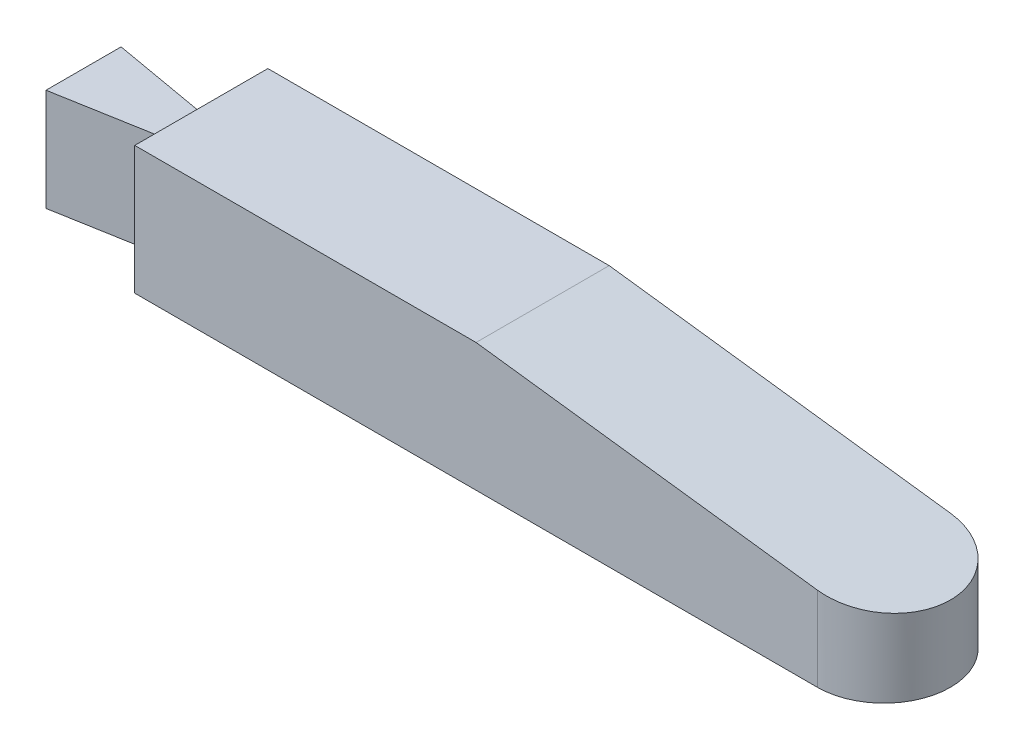
ISO-10303-21;
HEADER;
FILE_DESCRIPTION(('STEP AP214'),'2;1');
FILE_NAME('part.step','',(''),(''),'','','');
FILE_SCHEMA(('AUTOMOTIVE_DESIGN { 1 0 10303 214 1 1 1 1 }'));
ENDSEC;
DATA;
#1=APPLICATION_CONTEXT('core data for automotive mechanical design processes');
#2=APPLICATION_PROTOCOL_DEFINITION('international standard','automotive_design',2000,#1);
#3=PRODUCT_CONTEXT('',#1,'mechanical');
#4=PRODUCT('Part','Part','',(#3));
#5=PRODUCT_RELATED_PRODUCT_CATEGORY('part','',(#4));
#6=PRODUCT_DEFINITION_FORMATION('','',#4);
#7=PRODUCT_DEFINITION_CONTEXT('part definition',#1,'design');
#8=PRODUCT_DEFINITION('design','',#6,#7);
#9=PRODUCT_DEFINITION_SHAPE('','',#8);
#10=(LENGTH_UNIT() NAMED_UNIT(*) SI_UNIT(.MILLI.,.METRE.));
#11=(NAMED_UNIT(*) PLANE_ANGLE_UNIT() SI_UNIT($,.RADIAN.));
#12=(NAMED_UNIT(*) SI_UNIT($,.STERADIAN.) SOLID_ANGLE_UNIT());
#13=UNCERTAINTY_MEASURE_WITH_UNIT(LENGTH_MEASURE(1.E-05),#10,'distance_accuracy_value','');
#14=(GEOMETRIC_REPRESENTATION_CONTEXT(3) GLOBAL_UNCERTAINTY_ASSIGNED_CONTEXT((#13)) GLOBAL_UNIT_ASSIGNED_CONTEXT((#10,
#11,#12)) REPRESENTATION_CONTEXT('',''));
#15=CARTESIAN_POINT('',(0.,0.,0.));
#16=DIRECTION('',(0.,0.,1.));
#17=DIRECTION('',(1.,0.,0.));
#18=AXIS2_PLACEMENT_3D('',#15,#16,#17);
#19=CARTESIAN_POINT('',(-35.052,38.1,8.63600000000001));
#20=DIRECTION('',(-0.173648177666927,0.,0.984807753012209));
#21=DIRECTION('',(0.984807753012209,0.,0.173648177666927));
#22=AXIS2_PLACEMENT_3D('',#19,#20,#21);
#23=PLANE('',#22);
#24=DIRECTION('',(-0.984807753012209,0.,-0.173648177666927));
#25=VECTOR('',#24,1.);
#26=CARTESIAN_POINT('',(0.,30.48,14.816613327793));
#27=LINE('',#26,#25);
#28=CARTESIAN_POINT('',(0.,30.48,14.816613327793));
#29=VERTEX_POINT('',#28);
#30=CARTESIAN_POINT('',(-35.052,30.48,8.63600000000001));
#31=VERTEX_POINT('',#30);
#32=EDGE_CURVE('E198',#29,#31,#27,.T.);
#33=ORIENTED_EDGE('',*,*,#32,.F.);
#34=DIRECTION('',(0.,-1.,0.));
#35=VECTOR('',#34,1.);
#36=CARTESIAN_POINT('',(0.,38.1,14.816613327793));
#37=LINE('',#36,#35);
#38=CARTESIAN_POINT('',(0.,0.,14.816613327793));
#39=VERTEX_POINT('',#38);
#40=EDGE_CURVE('E11',#29,#39,#37,.T.);
#41=ORIENTED_EDGE('',*,*,#40,.T.);
#42=DIRECTION('',(-0.984807753012209,0.,-0.173648177666927));
#43=VECTOR('',#42,1.);
#44=CARTESIAN_POINT('',(-35.052,0.,8.63600000000001));
#45=LINE('',#44,#43);
#46=CARTESIAN_POINT('',(-35.052,0.,8.63600000000001));
#47=VERTEX_POINT('',#46);
#48=EDGE_CURVE('E124',#39,#47,#45,.T.);
#49=ORIENTED_EDGE('',*,*,#48,.T.);
#50=DIRECTION('',(0.,-1.,0.));
#51=VECTOR('',#50,1.);
#52=CARTESIAN_POINT('',(-35.052,38.1,8.63600000000001));
#53=LINE('',#52,#51);
#54=EDGE_CURVE('E53',#31,#47,#53,.T.);
#55=ORIENTED_EDGE('',*,*,#54,.F.);
#56=EDGE_LOOP('',(#33,#41,#49,#55));
#57=FACE_BOUND('',#56,.T.);
#58=ADVANCED_FACE('F45',(#57),#23,.F.);
#59=CARTESIAN_POINT('',(-35.052,38.1,8.63600000000001));
#60=DIRECTION('',(1.,0.,0.));
#61=DIRECTION('',(0.,0.,-1.));
#62=AXIS2_PLACEMENT_3D('',#59,#60,#61);
#63=PLANE('',#62);
#64=DIRECTION('',(0.,0.,1.));
#65=VECTOR('',#64,1.);
#66=CARTESIAN_POINT('',(-35.052,30.48,8.63600000000001));
#67=LINE('',#66,#65);
#68=CARTESIAN_POINT('',(-35.052,30.48,30.988));
#69=VERTEX_POINT('',#68);
#70=EDGE_CURVE('E177',#31,#69,#67,.T.);
#71=ORIENTED_EDGE('',*,*,#70,.F.);
#72=ORIENTED_EDGE('',*,*,#54,.T.);
#73=DIRECTION('',(0.,0.,1.));
#74=VECTOR('',#73,1.);
#75=CARTESIAN_POINT('',(-35.052,0.,8.63600000000001));
#76=LINE('',#75,#74);
#77=CARTESIAN_POINT('',(-35.052,0.,30.988));
#78=VERTEX_POINT('',#77);
#79=EDGE_CURVE('E130',#47,#78,#76,.T.);
#80=ORIENTED_EDGE('',*,*,#79,.T.);
#81=DIRECTION('',(0.,-1.,0.));
#82=VECTOR('',#81,1.);
#83=CARTESIAN_POINT('',(-35.052,38.1,30.988));
#84=LINE('',#83,#82);
#85=EDGE_CURVE('E166',#69,#78,#84,.T.);
#86=ORIENTED_EDGE('',*,*,#85,.F.);
#87=EDGE_LOOP('',(#71,#72,#80,#86));
#88=FACE_BOUND('',#87,.T.);
#89=ADVANCED_FACE('F172',(#88),#63,.F.);
#90=CARTESIAN_POINT('',(-35.052,38.1,30.988));
#91=DIRECTION('',(-0.173648177666928,0.,-0.984807753012209));
#92=DIRECTION('',(-0.984807753012209,0.,0.173648177666928));
#93=AXIS2_PLACEMENT_3D('',#90,#91,#92);
#94=PLANE('',#93);
#95=DIRECTION('',(0.984807753012208,0.,-0.173648177666928));
#96=VECTOR('',#95,1.);
#97=CARTESIAN_POINT('',(-35.052,30.48,30.988));
#98=LINE('',#97,#96);
#99=CARTESIAN_POINT('',(0.,30.48,24.807386672207));
#100=VERTEX_POINT('',#99);
#101=EDGE_CURVE('E133',#69,#100,#98,.T.);
#102=ORIENTED_EDGE('',*,*,#101,.F.);
#103=ORIENTED_EDGE('',*,*,#85,.T.);
#104=DIRECTION('',(0.984807753012208,0.,-0.173648177666928));
#105=VECTOR('',#104,1.);
#106=CARTESIAN_POINT('',(-35.052,0.,30.988));
#107=LINE('',#106,#105);
#108=CARTESIAN_POINT('',(0.,0.,24.807386672207));
#109=VERTEX_POINT('',#108);
#110=EDGE_CURVE('E141',#78,#109,#107,.T.);
#111=ORIENTED_EDGE('',*,*,#110,.T.);
#112=DIRECTION('',(0.,-1.,0.));
#113=VECTOR('',#112,1.);
#114=CARTESIAN_POINT('',(0.,38.1,24.807386672207));
#115=LINE('',#114,#113);
#116=EDGE_CURVE('E163',#100,#109,#115,.T.);
#117=ORIENTED_EDGE('',*,*,#116,.F.);
#118=EDGE_LOOP('',(#102,#103,#111,#117));
#119=FACE_BOUND('',#118,.T.);
#120=ADVANCED_FACE('F185',(#119),#94,.F.);
#121=CARTESIAN_POINT('',(0.,38.1,39.624));
#122=DIRECTION('',(1.,0.,0.));
#123=DIRECTION('',(0.,0.,-1.));
#124=AXIS2_PLACEMENT_3D('',#121,#122,#123);
#125=PLANE('',#124);
#126=DIRECTION('',(0.,0.,1.));
#127=VECTOR('',#126,1.);
#128=CARTESIAN_POINT('',(0.,0.,39.624));
#129=LINE('',#128,#127);
#130=CARTESIAN_POINT('',(0.,0.,39.624));
#131=VERTEX_POINT('',#130);
#132=EDGE_CURVE('E145',#109,#131,#129,.T.);
#133=ORIENTED_EDGE('',*,*,#132,.T.);
#134=DIRECTION('',(0.,-1.,0.));
#135=VECTOR('',#134,1.);
#136=CARTESIAN_POINT('',(0.,38.1,39.624));
#137=LINE('',#136,#135);
#138=CARTESIAN_POINT('',(0.,38.1,39.624));
#139=VERTEX_POINT('',#138);
#140=EDGE_CURVE('E159',#139,#131,#137,.T.);
#141=ORIENTED_EDGE('',*,*,#140,.F.);
#142=DIRECTION('',(0.,0.,1.));
#143=VECTOR('',#142,1.);
#144=CARTESIAN_POINT('',(0.,38.1,0.));
#145=LINE('',#144,#143);
#146=CARTESIAN_POINT('',(0.,38.1,0.));
#147=VERTEX_POINT('',#146);
#148=EDGE_CURVE('E109',#147,#139,#145,.T.);
#149=ORIENTED_EDGE('',*,*,#148,.F.);
#150=DIRECTION('',(0.,-1.,0.));
#151=VECTOR('',#150,1.);
#152=CARTESIAN_POINT('',(0.,38.1,0.));
#153=LINE('',#152,#151);
#154=CARTESIAN_POINT('',(0.,0.,0.));
#155=VERTEX_POINT('',#154);
#156=EDGE_CURVE('E100',#147,#155,#153,.T.);
#157=ORIENTED_EDGE('',*,*,#156,.T.);
#158=DIRECTION('',(0.,0.,1.));
#159=VECTOR('',#158,1.);
#160=CARTESIAN_POINT('',(0.,0.,0.));
#161=LINE('',#160,#159);
#162=EDGE_CURVE('E116',#155,#39,#161,.T.);
#163=ORIENTED_EDGE('',*,*,#162,.T.);
#164=ORIENTED_EDGE('',*,*,#40,.F.);
#165=DIRECTION('',(0.,0.,-1.));
#166=VECTOR('',#165,1.);
#167=CARTESIAN_POINT('',(0.,30.48,24.807386672207));
#168=LINE('',#167,#166);
#169=EDGE_CURVE('E126',#100,#29,#168,.T.);
#170=ORIENTED_EDGE('',*,*,#169,.F.);
#171=ORIENTED_EDGE('',*,*,#116,.T.);
#172=EDGE_LOOP('',(#133,#141,#149,#157,#163,#164,#170,#171));
#173=FACE_BOUND('',#172,.T.);
#174=ADVANCED_FACE('F114',(#173),#125,.F.);
#175=CARTESIAN_POINT('',(0.,38.1,39.624));
#176=DIRECTION('',(0.,0.,-1.));
#177=DIRECTION('',(-1.,0.,0.));
#178=AXIS2_PLACEMENT_3D('',#175,#176,#177);
#179=PLANE('',#178);
#180=DIRECTION('',(0.,-1.,0.));
#181=VECTOR('',#180,1.);
#182=CARTESIAN_POINT('',(203.2,38.1,39.6239999999999));
#183=LINE('',#182,#181);
#184=CARTESIAN_POINT('',(203.2,25.062054565206,39.624));
#185=VERTEX_POINT('',#184);
#186=CARTESIAN_POINT('',(203.2,0.,39.6239999999999));
#187=VERTEX_POINT('',#186);
#188=EDGE_CURVE('E156',#185,#187,#183,.T.);
#189=ORIENTED_EDGE('',*,*,#188,.F.);
#190=DIRECTION('',(0.99186650650236,-0.127282493999779,0.));
#191=VECTOR('',#190,1.);
#192=CARTESIAN_POINT('',(101.6,38.1,39.624));
#193=LINE('',#192,#191);
#194=CARTESIAN_POINT('',(101.6,38.1,39.624));
#195=VERTEX_POINT('',#194);
#196=EDGE_CURVE('E227',#195,#185,#193,.T.);
#197=ORIENTED_EDGE('',*,*,#196,.F.);
#198=DIRECTION('',(1.,0.,0.));
#199=VECTOR('',#198,1.);
#200=CARTESIAN_POINT('',(0.,38.1,39.624));
#201=LINE('',#200,#199);
#202=EDGE_CURVE('E213',#139,#195,#201,.T.);
#203=ORIENTED_EDGE('',*,*,#202,.F.);
#204=ORIENTED_EDGE('',*,*,#140,.T.);
#205=DIRECTION('',(1.,0.,0.));
#206=VECTOR('',#205,1.);
#207=CARTESIAN_POINT('',(0.,0.,39.624));
#208=LINE('',#207,#206);
#209=EDGE_CURVE('E148',#131,#187,#208,.T.);
#210=ORIENTED_EDGE('',*,*,#209,.T.);
#211=EDGE_LOOP('',(#189,#197,#203,#204,#210));
#212=FACE_BOUND('',#211,.T.);
#213=ADVANCED_FACE('F225',(#212),#179,.F.);
#214=CARTESIAN_POINT('',(203.2,38.1,19.812));
#215=DIRECTION('',(0.,-1.,0.));
#216=DIRECTION('',(0.,0.,-1.));
#217=AXIS2_PLACEMENT_3D('',#214,#215,#216);
#218=CYLINDRICAL_SURFACE('',#217,19.8119999999999);
#219=CARTESIAN_POINT('',(203.2,25.062054565206,19.812));
#220=DIRECTION('',(-0.127282493999779,-0.99186650650236,0.));
#221=DIRECTION('',(0.99186650650236,-0.127282493999779,0.));
#222=AXIS2_PLACEMENT_3D('',#219,#220,#221);
#223=ELLIPSE('',#222,19.9744621580816,19.8119999999999);
#224=CARTESIAN_POINT('',(203.2,25.062054565206,0.));
#225=VERTEX_POINT('',#224);
#226=EDGE_CURVE('E200',#225,#185,#223,.T.);
#227=ORIENTED_EDGE('',*,*,#226,.T.);
#228=ORIENTED_EDGE('',*,*,#188,.T.);
#229=CARTESIAN_POINT('',(203.2,0.,19.812));
#230=DIRECTION('',(0.,1.,0.));
#231=DIRECTION('',(0.,0.,-1.));
#232=AXIS2_PLACEMENT_3D('',#229,#230,#231);
#233=CIRCLE('',#232,19.8119999999999);
#234=CARTESIAN_POINT('',(203.2,0.,0.));
#235=VERTEX_POINT('',#234);
#236=EDGE_CURVE('E110',#187,#235,#233,.T.);
#237=ORIENTED_EDGE('',*,*,#236,.T.);
#238=DIRECTION('',(0.,-1.,0.));
#239=VECTOR('',#238,1.);
#240=CARTESIAN_POINT('',(203.2,38.1,0.));
#241=LINE('',#240,#239);
#242=EDGE_CURVE('E103',#225,#235,#241,.T.);
#243=ORIENTED_EDGE('',*,*,#242,.F.);
#244=EDGE_LOOP('',(#227,#228,#237,#243));
#245=FACE_BOUND('',#244,.T.);
#246=ADVANCED_FACE('F255',(#245),#218,.T.);
#247=CARTESIAN_POINT('',(0.,38.1,0.));
#248=DIRECTION('',(0.,0.,1.));
#249=DIRECTION('',(1.,0.,0.));
#250=AXIS2_PLACEMENT_3D('',#247,#248,#249);
#251=PLANE('',#250);
#252=DIRECTION('',(-1.,0.,0.));
#253=VECTOR('',#252,1.);
#254=CARTESIAN_POINT('',(0.,38.1,0.));
#255=LINE('',#254,#253);
#256=CARTESIAN_POINT('',(101.6,38.1,0.));
#257=VERTEX_POINT('',#256);
#258=EDGE_CURVE('E68',#257,#147,#255,.T.);
#259=ORIENTED_EDGE('',*,*,#258,.F.);
#260=DIRECTION('',(0.99186650650236,-0.127282493999779,0.));
#261=VECTOR('',#260,1.);
#262=CARTESIAN_POINT('',(101.6,38.1,0.));
#263=LINE('',#262,#261);
#264=EDGE_CURVE('E60',#257,#225,#263,.T.);
#265=ORIENTED_EDGE('',*,*,#264,.T.);
#266=ORIENTED_EDGE('',*,*,#242,.T.);
#267=DIRECTION('',(-1.,0.,0.));
#268=VECTOR('',#267,1.);
#269=CARTESIAN_POINT('',(0.,0.,0.));
#270=LINE('',#269,#268);
#271=EDGE_CURVE('E97',#235,#155,#270,.T.);
#272=ORIENTED_EDGE('',*,*,#271,.T.);
#273=ORIENTED_EDGE('',*,*,#156,.F.);
#274=EDGE_LOOP('',(#259,#265,#266,#272,#273));
#275=FACE_BOUND('',#274,.T.);
#276=ADVANCED_FACE('F99',(#275),#251,.F.);
#277=CARTESIAN_POINT('',(203.2,38.1,19.812));
#278=DIRECTION('',(0.,-1.,0.));
#279=DIRECTION('',(0.,0.,-1.));
#280=AXIS2_PLACEMENT_3D('',#277,#278,#279);
#281=PLANE('',#280);
#282=ORIENTED_EDGE('',*,*,#202,.T.);
#283=DIRECTION('',(0.,0.,1.));
#284=VECTOR('',#283,1.);
#285=CARTESIAN_POINT('',(101.6,38.1,0.));
#286=LINE('',#285,#284);
#287=EDGE_CURVE('E206',#257,#195,#286,.T.);
#288=ORIENTED_EDGE('',*,*,#287,.F.);
#289=ORIENTED_EDGE('',*,*,#258,.T.);
#290=ORIENTED_EDGE('',*,*,#148,.T.);
#291=EDGE_LOOP('',(#282,#288,#289,#290));
#292=FACE_BOUND('',#291,.T.);
#293=ADVANCED_FACE('F219',(#292),#281,.F.);
#294=CARTESIAN_POINT('',(203.2,0.,19.812));
#295=DIRECTION('',(0.,-1.,0.));
#296=DIRECTION('',(0.,0.,-1.));
#297=AXIS2_PLACEMENT_3D('',#294,#295,#296);
#298=PLANE('',#297);
#299=ORIENTED_EDGE('',*,*,#162,.F.);
#300=ORIENTED_EDGE('',*,*,#271,.F.);
#301=ORIENTED_EDGE('',*,*,#236,.F.);
#302=ORIENTED_EDGE('',*,*,#209,.F.);
#303=ORIENTED_EDGE('',*,*,#132,.F.);
#304=ORIENTED_EDGE('',*,*,#110,.F.);
#305=ORIENTED_EDGE('',*,*,#79,.F.);
#306=ORIENTED_EDGE('',*,*,#48,.F.);
#307=EDGE_LOOP('',(#299,#300,#301,#302,#303,#304,#305,#306));
#308=FACE_BOUND('',#307,.T.);
#309=ADVANCED_FACE('F121',(#308),#298,.T.);
#310=CARTESIAN_POINT('',(0.,30.48,0.));
#311=DIRECTION('',(0.,1.,0.));
#312=DIRECTION('',(0.,0.,1.));
#313=AXIS2_PLACEMENT_3D('',#310,#311,#312);
#314=PLANE('',#313);
#315=ORIENTED_EDGE('',*,*,#32,.T.);
#316=ORIENTED_EDGE('',*,*,#70,.T.);
#317=ORIENTED_EDGE('',*,*,#101,.T.);
#318=ORIENTED_EDGE('',*,*,#169,.T.);
#319=EDGE_LOOP('',(#315,#316,#317,#318));
#320=FACE_BOUND('',#319,.T.);
#321=ADVANCED_FACE('F197',(#320),#314,.T.);
#322=CARTESIAN_POINT('',(101.6,38.1,0.));
#323=DIRECTION('',(-0.127282493999779,-0.99186650650236,0.));
#324=DIRECTION('',(0.99186650650236,-0.127282493999779,0.));
#325=AXIS2_PLACEMENT_3D('',#322,#323,#324);
#326=PLANE('',#325);
#327=ORIENTED_EDGE('',*,*,#226,.F.);
#328=ORIENTED_EDGE('',*,*,#264,.F.);
#329=ORIENTED_EDGE('',*,*,#287,.T.);
#330=ORIENTED_EDGE('',*,*,#196,.T.);
#331=EDGE_LOOP('',(#327,#328,#329,#330));
#332=FACE_BOUND('',#331,.T.);
#333=ADVANCED_FACE('F233',(#332),#326,.F.);
#334=CLOSED_SHELL('',(#58,#89,#120,#174,#213,#246,#276,#293,#309,#321,#333));
#335=MANIFOLD_SOLID_BREP('B2',#334);
#336=ADVANCED_BREP_SHAPE_REPRESENTATION('',(#18,#335),#14);
#337=SHAPE_DEFINITION_REPRESENTATION(#9,#336);
ENDSEC;
END-ISO-10303-21;
